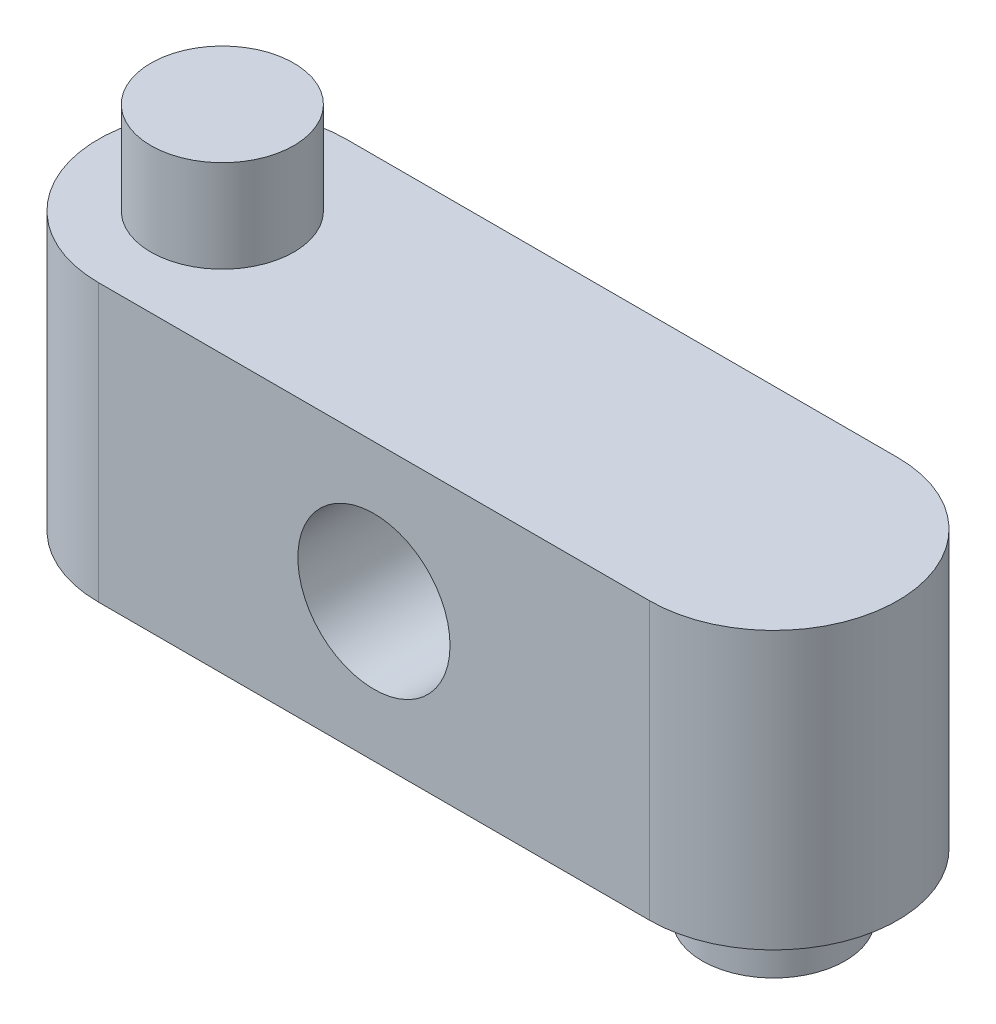
ISO-10303-21;
HEADER;
FILE_DESCRIPTION(('STEP AP214'),'2;1');
FILE_NAME('part.step','',(''),(''),'','','');
FILE_SCHEMA(('AUTOMOTIVE_DESIGN { 1 0 10303 214 1 1 1 1 }'));
ENDSEC;
DATA;
#1=APPLICATION_CONTEXT('core data for automotive mechanical design processes');
#2=APPLICATION_PROTOCOL_DEFINITION('international standard','automotive_design',2000,#1);
#3=PRODUCT_CONTEXT('',#1,'mechanical');
#4=PRODUCT('Part','Part','',(#3));
#5=PRODUCT_RELATED_PRODUCT_CATEGORY('part','',(#4));
#6=PRODUCT_DEFINITION_FORMATION('','',#4);
#7=PRODUCT_DEFINITION_CONTEXT('part definition',#1,'design');
#8=PRODUCT_DEFINITION('design','',#6,#7);
#9=PRODUCT_DEFINITION_SHAPE('','',#8);
#10=(LENGTH_UNIT() NAMED_UNIT(*) SI_UNIT(.MILLI.,.METRE.));
#11=(NAMED_UNIT(*) PLANE_ANGLE_UNIT() SI_UNIT($,.RADIAN.));
#12=(NAMED_UNIT(*) SI_UNIT($,.STERADIAN.) SOLID_ANGLE_UNIT());
#13=UNCERTAINTY_MEASURE_WITH_UNIT(LENGTH_MEASURE(1.E-05),#10,'distance_accuracy_value','');
#14=(GEOMETRIC_REPRESENTATION_CONTEXT(3) GLOBAL_UNCERTAINTY_ASSIGNED_CONTEXT((#13)) GLOBAL_UNIT_ASSIGNED_CONTEXT((#10,
#11,#12)) REPRESENTATION_CONTEXT('',''));
#15=CARTESIAN_POINT('',(0.,0.,0.));
#16=DIRECTION('',(0.,0.,1.));
#17=DIRECTION('',(1.,0.,0.));
#18=AXIS2_PLACEMENT_3D('',#15,#16,#17);
#19=CARTESIAN_POINT('',(0.,9.,-12.4853389132924));
#20=DIRECTION('',(0.,0.,-1.));
#21=DIRECTION('',(-1.,0.,0.));
#22=AXIS2_PLACEMENT_3D('',#19,#20,#21);
#23=PLANE('',#22);
#24=CARTESIAN_POINT('',(-58.8563358786887,4.5,-12.4853389132924));
#25=DIRECTION('',(0.,0.,-1.));
#26=DIRECTION('',(-1.,0.,0.));
#27=AXIS2_PLACEMENT_3D('',#24,#25,#26);
#28=CIRCLE('',#27,2.475);
#29=CARTESIAN_POINT('',(-61.3313358786887,4.5,-12.4853389132924));
#30=VERTEX_POINT('',#29);
#31=EDGE_CURVE('E108',#30,#30,#28,.T.);
#32=ORIENTED_EDGE('',*,*,#31,.F.);
#33=EDGE_LOOP('',(#32));
#34=FACE_BOUND('',#33,.T.);
#35=DIRECTION('',(1.,0.,0.));
#36=VECTOR('',#35,1.);
#37=CARTESIAN_POINT('',(0.,0.,-12.4853389132924));
#38=LINE('',#37,#36);
#39=CARTESIAN_POINT('',(-67.8213358786887,0.,-12.4853389132924));
#40=VERTEX_POINT('',#39);
#41=CARTESIAN_POINT('',(-49.8913358786887,0.,-12.4853389132924));
#42=VERTEX_POINT('',#41);
#43=EDGE_CURVE('E105',#40,#42,#38,.T.);
#44=ORIENTED_EDGE('',*,*,#43,.F.);
#45=DIRECTION('',(0.,-1.,0.));
#46=VECTOR('',#45,1.);
#47=CARTESIAN_POINT('',(-67.8213358786887,9.,-12.4853389132924));
#48=LINE('',#47,#46);
#49=CARTESIAN_POINT('',(-67.8213358786887,9.,-12.4853389132924));
#50=VERTEX_POINT('',#49);
#51=EDGE_CURVE('E11',#50,#40,#48,.T.);
#52=ORIENTED_EDGE('',*,*,#51,.F.);
#53=DIRECTION('',(1.,0.,0.));
#54=VECTOR('',#53,1.);
#55=CARTESIAN_POINT('',(0.,9.,-12.4853389132924));
#56=LINE('',#55,#54);
#57=CARTESIAN_POINT('',(-49.8913358786887,9.,-12.4853389132924));
#58=VERTEX_POINT('',#57);
#59=EDGE_CURVE('E92',#50,#58,#56,.T.);
#60=ORIENTED_EDGE('',*,*,#59,.T.);
#61=DIRECTION('',(0.,-1.,0.));
#62=VECTOR('',#61,1.);
#63=CARTESIAN_POINT('',(-49.8913358786887,9.,-12.4853389132924));
#64=LINE('',#63,#62);
#65=EDGE_CURVE('E81',#58,#42,#64,.T.);
#66=ORIENTED_EDGE('',*,*,#65,.T.);
#67=EDGE_LOOP('',(#44,#52,#60,#66));
#68=FACE_BOUND('',#67,.T.);
#69=ADVANCED_FACE('F41',(#34,#68),#23,.T.);
#70=CARTESIAN_POINT('',(-67.8213358786887,9.,-8.45033891329243));
#71=DIRECTION('',(0.,-1.,0.));
#72=DIRECTION('',(0.,0.,-1.));
#73=AXIS2_PLACEMENT_3D('',#70,#71,#72);
#74=CYLINDRICAL_SURFACE('',#73,4.035);
#75=CARTESIAN_POINT('',(-67.8213358786887,0.,-8.45033891329243));
#76=DIRECTION('',(0.,1.,0.));
#77=DIRECTION('',(0.,0.,1.));
#78=AXIS2_PLACEMENT_3D('',#75,#76,#77);
#79=CIRCLE('',#78,4.035);
#80=CARTESIAN_POINT('',(-67.8213358786887,0.,-4.41533891329243));
#81=VERTEX_POINT('',#80);
#82=EDGE_CURVE('E97',#40,#81,#79,.T.);
#83=ORIENTED_EDGE('',*,*,#82,.T.);
#84=DIRECTION('',(0.,-1.,0.));
#85=VECTOR('',#84,1.);
#86=CARTESIAN_POINT('',(-67.8213358786887,9.,-4.41533891329243));
#87=LINE('',#86,#85);
#88=CARTESIAN_POINT('',(-67.8213358786887,9.,-4.41533891329243));
#89=VERTEX_POINT('',#88);
#90=EDGE_CURVE('E50',#89,#81,#87,.T.);
#91=ORIENTED_EDGE('',*,*,#90,.F.);
#92=CARTESIAN_POINT('',(-67.8213358786887,9.,-8.45033891329243));
#93=DIRECTION('',(0.,1.,0.));
#94=DIRECTION('',(0.,0.,1.));
#95=AXIS2_PLACEMENT_3D('',#92,#93,#94);
#96=CIRCLE('',#95,4.035);
#97=EDGE_CURVE('E87',#50,#89,#96,.T.);
#98=ORIENTED_EDGE('',*,*,#97,.F.);
#99=ORIENTED_EDGE('',*,*,#51,.T.);
#100=EDGE_LOOP('',(#83,#91,#98,#99));
#101=FACE_BOUND('',#100,.T.);
#102=ADVANCED_FACE('F95',(#101),#74,.T.);
#103=CARTESIAN_POINT('',(0.,9.,-4.41533891329243));
#104=DIRECTION('',(0.,0.,-1.));
#105=DIRECTION('',(-1.,0.,0.));
#106=AXIS2_PLACEMENT_3D('',#103,#104,#105);
#107=PLANE('',#106);
#108=CARTESIAN_POINT('',(-58.8563358786887,4.5,-4.41533891329243));
#109=DIRECTION('',(0.,0.,1.));
#110=DIRECTION('',(1.,0.,0.));
#111=AXIS2_PLACEMENT_3D('',#108,#109,#110);
#112=CIRCLE('',#111,2.475);
#113=CARTESIAN_POINT('',(-56.3813358786887,4.5,-4.41533891329243));
#114=VERTEX_POINT('',#113);
#115=EDGE_CURVE('E129',#114,#114,#112,.T.);
#116=ORIENTED_EDGE('',*,*,#115,.F.);
#117=EDGE_LOOP('',(#116));
#118=FACE_BOUND('',#117,.T.);
#119=DIRECTION('',(1.,0.,0.));
#120=VECTOR('',#119,1.);
#121=CARTESIAN_POINT('',(0.,0.,-4.41533891329243));
#122=LINE('',#121,#120);
#123=CARTESIAN_POINT('',(-49.8913358786887,0.,-4.41533891329243));
#124=VERTEX_POINT('',#123);
#125=EDGE_CURVE('E74',#81,#124,#122,.T.);
#126=ORIENTED_EDGE('',*,*,#125,.T.);
#127=DIRECTION('',(0.,-1.,0.));
#128=VECTOR('',#127,1.);
#129=CARTESIAN_POINT('',(-49.8913358786887,9.,-4.41533891329243));
#130=LINE('',#129,#128);
#131=CARTESIAN_POINT('',(-49.8913358786887,9.,-4.41533891329243));
#132=VERTEX_POINT('',#131);
#133=EDGE_CURVE('E98',#132,#124,#130,.T.);
#134=ORIENTED_EDGE('',*,*,#133,.F.);
#135=DIRECTION('',(1.,0.,0.));
#136=VECTOR('',#135,1.);
#137=CARTESIAN_POINT('',(0.,9.,-4.41533891329243));
#138=LINE('',#137,#136);
#139=EDGE_CURVE('E91',#89,#132,#138,.T.);
#140=ORIENTED_EDGE('',*,*,#139,.F.);
#141=ORIENTED_EDGE('',*,*,#90,.T.);
#142=EDGE_LOOP('',(#126,#134,#140,#141));
#143=FACE_BOUND('',#142,.T.);
#144=ADVANCED_FACE('F100',(#118,#143),#107,.F.);
#145=CARTESIAN_POINT('',(-49.8913358786887,9.,-8.45033891329243));
#146=DIRECTION('',(0.,-1.,0.));
#147=DIRECTION('',(0.,0.,-1.));
#148=AXIS2_PLACEMENT_3D('',#145,#146,#147);
#149=CYLINDRICAL_SURFACE('',#148,4.035);
#150=CARTESIAN_POINT('',(-49.8913358786887,0.,-8.45033891329243));
#151=DIRECTION('',(0.,1.,0.));
#152=DIRECTION('',(0.,0.,1.));
#153=AXIS2_PLACEMENT_3D('',#150,#151,#152);
#154=CIRCLE('',#153,4.035);
#155=EDGE_CURVE('E111',#124,#42,#154,.T.);
#156=ORIENTED_EDGE('',*,*,#155,.T.);
#157=ORIENTED_EDGE('',*,*,#65,.F.);
#158=CARTESIAN_POINT('',(-49.8913358786887,9.,-8.45033891329243));
#159=DIRECTION('',(0.,1.,0.));
#160=DIRECTION('',(0.,0.,1.));
#161=AXIS2_PLACEMENT_3D('',#158,#159,#160);
#162=CIRCLE('',#161,4.035);
#163=EDGE_CURVE('E58',#132,#58,#162,.T.);
#164=ORIENTED_EDGE('',*,*,#163,.F.);
#165=ORIENTED_EDGE('',*,*,#133,.T.);
#166=EDGE_LOOP('',(#156,#157,#164,#165));
#167=FACE_BOUND('',#166,.T.);
#168=ADVANCED_FACE('F116',(#167),#149,.T.);
#169=CARTESIAN_POINT('',(0.,9.,0.));
#170=DIRECTION('',(0.,1.,0.));
#171=DIRECTION('',(0.,0.,1.));
#172=AXIS2_PLACEMENT_3D('',#169,#170,#171);
#173=PLANE('',#172);
#174=CARTESIAN_POINT('',(-67.8213358786887,9.,-8.45033891329243));
#175=DIRECTION('',(0.,1.,0.));
#176=DIRECTION('',(0.,0.,1.));
#177=AXIS2_PLACEMENT_3D('',#174,#175,#176);
#178=CIRCLE('',#177,2.32499999999999);
#179=CARTESIAN_POINT('',(-67.8213358786887,9.,-6.12533891329244));
#180=VERTEX_POINT('',#179);
#181=EDGE_CURVE('E137',#180,#180,#178,.F.);
#182=ORIENTED_EDGE('',*,*,#181,.T.);
#183=EDGE_LOOP('',(#182));
#184=FACE_BOUND('',#183,.T.);
#185=ORIENTED_EDGE('',*,*,#59,.F.);
#186=ORIENTED_EDGE('',*,*,#97,.T.);
#187=ORIENTED_EDGE('',*,*,#139,.T.);
#188=ORIENTED_EDGE('',*,*,#163,.T.);
#189=EDGE_LOOP('',(#185,#186,#187,#188));
#190=FACE_BOUND('',#189,.T.);
#191=ADVANCED_FACE('F89',(#184,#190),#173,.T.);
#192=CARTESIAN_POINT('',(0.,0.,0.));
#193=DIRECTION('',(0.,1.,0.));
#194=DIRECTION('',(0.,0.,1.));
#195=AXIS2_PLACEMENT_3D('',#192,#193,#194);
#196=PLANE('',#195);
#197=CARTESIAN_POINT('',(-49.8913358786887,0.,-8.45033891329243));
#198=DIRECTION('',(0.,1.,0.));
#199=DIRECTION('',(0.,0.,1.));
#200=AXIS2_PLACEMENT_3D('',#197,#198,#199);
#201=CIRCLE('',#200,2.325);
#202=CARTESIAN_POINT('',(-49.8913358786887,0.,-6.12533891329243));
#203=VERTEX_POINT('',#202);
#204=EDGE_CURVE('E44',#203,#203,#201,.T.);
#205=ORIENTED_EDGE('',*,*,#204,.T.);
#206=EDGE_LOOP('',(#205));
#207=FACE_BOUND('',#206,.T.);
#208=ORIENTED_EDGE('',*,*,#43,.T.);
#209=ORIENTED_EDGE('',*,*,#155,.F.);
#210=ORIENTED_EDGE('',*,*,#125,.F.);
#211=ORIENTED_EDGE('',*,*,#82,.F.);
#212=EDGE_LOOP('',(#208,#209,#210,#211));
#213=FACE_BOUND('',#212,.T.);
#214=ADVANCED_FACE('F118',(#207,#213),#196,.F.);
#215=CARTESIAN_POINT('',(-58.8563358786887,4.5,-18.4153389132924));
#216=DIRECTION('',(0.,0.,1.));
#217=DIRECTION('',(1.,0.,0.));
#218=AXIS2_PLACEMENT_3D('',#215,#216,#217);
#219=CYLINDRICAL_SURFACE('',#218,2.475);
#220=ORIENTED_EDGE('',*,*,#31,.T.);
#221=EDGE_LOOP('',(#220));
#222=FACE_BOUND('',#221,.T.);
#223=ORIENTED_EDGE('',*,*,#115,.T.);
#224=EDGE_LOOP('',(#223));
#225=FACE_BOUND('',#224,.T.);
#226=ADVANCED_FACE('F164',(#222,#225),#219,.F.);
#227=CARTESIAN_POINT('',(-49.8913358786887,-2.,-8.45033891329243));
#228=DIRECTION('',(0.,1.,0.));
#229=DIRECTION('',(0.,0.,1.));
#230=AXIS2_PLACEMENT_3D('',#227,#228,#229);
#231=CYLINDRICAL_SURFACE('',#230,2.325);
#232=CARTESIAN_POINT('',(-49.8913358786887,-2.,-8.45033891329243));
#233=DIRECTION('',(0.,1.,0.));
#234=DIRECTION('',(0.,0.,1.));
#235=AXIS2_PLACEMENT_3D('',#232,#233,#234);
#236=CIRCLE('',#235,2.325);
#237=CARTESIAN_POINT('',(-49.8913358786887,-2.,-6.12533891329243));
#238=VERTEX_POINT('',#237);
#239=EDGE_CURVE('E134',#238,#238,#236,.T.);
#240=ORIENTED_EDGE('',*,*,#239,.T.);
#241=EDGE_LOOP('',(#240));
#242=FACE_BOUND('',#241,.T.);
#243=ORIENTED_EDGE('',*,*,#204,.F.);
#244=EDGE_LOOP('',(#243));
#245=FACE_BOUND('',#244,.T.);
#246=ADVANCED_FACE('F157',(#242,#245),#231,.T.);
#247=CARTESIAN_POINT('',(0.,-2.,0.));
#248=DIRECTION('',(0.,1.,0.));
#249=DIRECTION('',(0.,0.,1.));
#250=AXIS2_PLACEMENT_3D('',#247,#248,#249);
#251=PLANE('',#250);
#252=ORIENTED_EDGE('',*,*,#239,.F.);
#253=EDGE_LOOP('',(#252));
#254=FACE_BOUND('',#253,.T.);
#255=ADVANCED_FACE('F148',(#254),#251,.F.);
#256=CARTESIAN_POINT('',(-67.8213358786887,12.,-8.45033891329243));
#257=DIRECTION('',(0.,-1.,0.));
#258=DIRECTION('',(0.,0.,-1.));
#259=AXIS2_PLACEMENT_3D('',#256,#257,#258);
#260=CYLINDRICAL_SURFACE('',#259,2.32499999999999);
#261=ORIENTED_EDGE('',*,*,#181,.F.);
#262=EDGE_LOOP('',(#261));
#263=FACE_BOUND('',#262,.T.);
#264=CARTESIAN_POINT('',(-67.8213358786887,12.,-8.45033891329243));
#265=DIRECTION('',(0.,1.,0.));
#266=DIRECTION('',(0.,0.,1.));
#267=AXIS2_PLACEMENT_3D('',#264,#265,#266);
#268=CIRCLE('',#267,2.32499999999999);
#269=CARTESIAN_POINT('',(-67.8213358786887,12.,-6.12533891329244));
#270=VERTEX_POINT('',#269);
#271=EDGE_CURVE('E140',#270,#270,#268,.T.);
#272=ORIENTED_EDGE('',*,*,#271,.F.);
#273=EDGE_LOOP('',(#272));
#274=FACE_BOUND('',#273,.T.);
#275=ADVANCED_FACE('F146',(#263,#274),#260,.T.);
#276=CARTESIAN_POINT('',(0.,12.,0.));
#277=DIRECTION('',(0.,1.,0.));
#278=DIRECTION('',(0.,0.,1.));
#279=AXIS2_PLACEMENT_3D('',#276,#277,#278);
#280=PLANE('',#279);
#281=ORIENTED_EDGE('',*,*,#271,.T.);
#282=EDGE_LOOP('',(#281));
#283=FACE_BOUND('',#282,.T.);
#284=ADVANCED_FACE('F144',(#283),#280,.T.);
#285=CLOSED_SHELL('',(#69,#102,#144,#168,#191,#214,#226,#246,#255,#275,#284));
#286=MANIFOLD_SOLID_BREP('B2',#285);
#287=ADVANCED_BREP_SHAPE_REPRESENTATION('',(#18,#286),#14);
#288=SHAPE_DEFINITION_REPRESENTATION(#9,#287);
ENDSEC;
END-ISO-10303-21;
